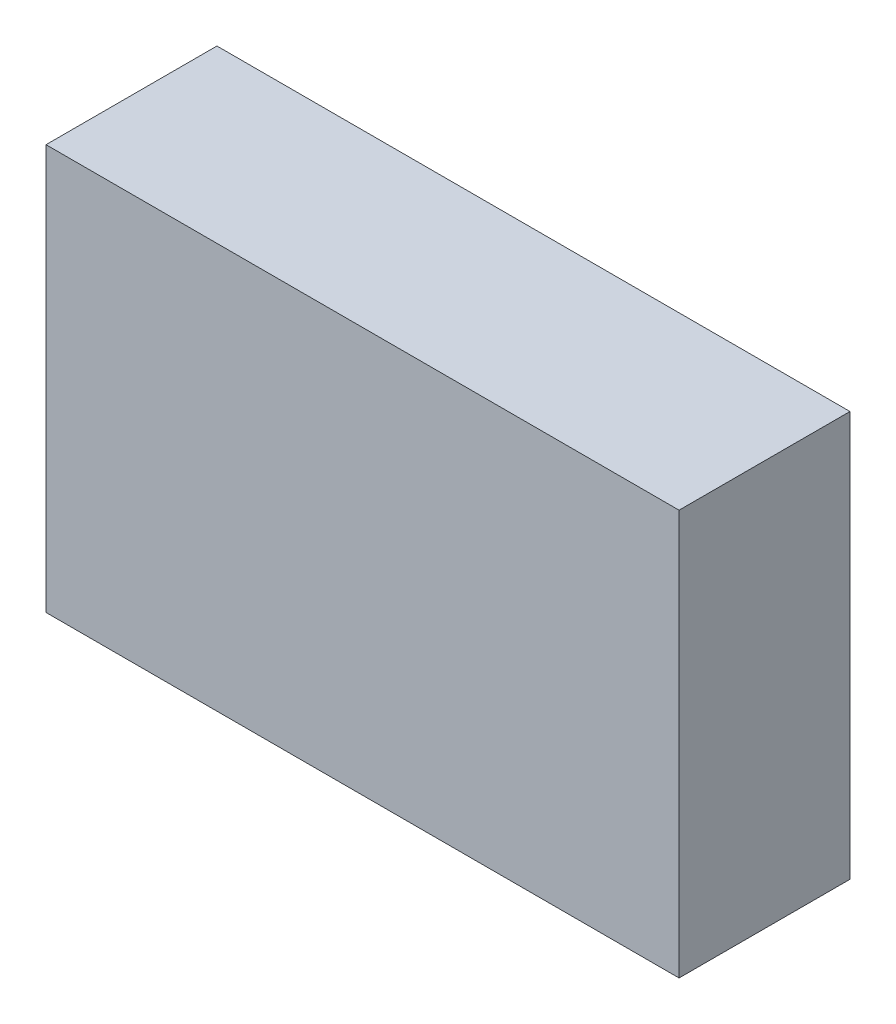
ISO-10303-21;
HEADER;
FILE_DESCRIPTION(('STEP AP214'),'2;1');
FILE_NAME('part.step','',(''),(''),'','','');
FILE_SCHEMA(('AUTOMOTIVE_DESIGN { 1 0 10303 214 1 1 1 1 }'));
ENDSEC;
DATA;
#1=APPLICATION_CONTEXT('core data for automotive mechanical design processes');
#2=APPLICATION_PROTOCOL_DEFINITION('international standard','automotive_design',2000,#1);
#3=PRODUCT_CONTEXT('',#1,'mechanical');
#4=PRODUCT('Part','Part','',(#3));
#5=PRODUCT_RELATED_PRODUCT_CATEGORY('part','',(#4));
#6=PRODUCT_DEFINITION_FORMATION('','',#4);
#7=PRODUCT_DEFINITION_CONTEXT('part definition',#1,'design');
#8=PRODUCT_DEFINITION('design','',#6,#7);
#9=PRODUCT_DEFINITION_SHAPE('','',#8);
#10=(LENGTH_UNIT() NAMED_UNIT(*) SI_UNIT(.MILLI.,.METRE.));
#11=(NAMED_UNIT(*) PLANE_ANGLE_UNIT() SI_UNIT($,.RADIAN.));
#12=(NAMED_UNIT(*) SI_UNIT($,.STERADIAN.) SOLID_ANGLE_UNIT());
#13=UNCERTAINTY_MEASURE_WITH_UNIT(LENGTH_MEASURE(1.E-05),#10,'distance_accuracy_value','');
#14=(GEOMETRIC_REPRESENTATION_CONTEXT(3) GLOBAL_UNCERTAINTY_ASSIGNED_CONTEXT((#13)) GLOBAL_UNIT_ASSIGNED_CONTEXT((#10,
#11,#12)) REPRESENTATION_CONTEXT('',''));
#15=CARTESIAN_POINT('',(0.,0.,0.));
#16=DIRECTION('',(0.,0.,1.));
#17=DIRECTION('',(1.,0.,0.));
#18=AXIS2_PLACEMENT_3D('',#15,#16,#17);
#19=CARTESIAN_POINT('',(0.,0.,1.35));
#20=DIRECTION('',(0.,0.,1.));
#21=DIRECTION('',(1.,0.,0.));
#22=AXIS2_PLACEMENT_3D('',#19,#20,#21);
#23=PLANE('',#22);
#24=DIRECTION('',(1.,0.,0.));
#25=VECTOR('',#24,1.);
#26=CARTESIAN_POINT('',(-2.5,-1.6,1.35));
#27=LINE('',#26,#25);
#28=CARTESIAN_POINT('',(-2.5,-1.6,1.35));
#29=VERTEX_POINT('',#28);
#30=CARTESIAN_POINT('',(2.5,-1.6,1.35));
#31=VERTEX_POINT('',#30);
#32=EDGE_CURVE('E84',#29,#31,#27,.T.);
#33=ORIENTED_EDGE('',*,*,#32,.T.);
#34=DIRECTION('',(0.,1.,0.));
#35=VECTOR('',#34,1.);
#36=CARTESIAN_POINT('',(2.5,-1.6,1.35));
#37=LINE('',#36,#35);
#38=CARTESIAN_POINT('',(2.5,1.6,1.35));
#39=VERTEX_POINT('',#38);
#40=EDGE_CURVE('E70',#31,#39,#37,.T.);
#41=ORIENTED_EDGE('',*,*,#40,.T.);
#42=DIRECTION('',(-1.,0.,0.));
#43=VECTOR('',#42,1.);
#44=CARTESIAN_POINT('',(2.5,1.6,1.35));
#45=LINE('',#44,#43);
#46=CARTESIAN_POINT('',(-2.5,1.6,1.35));
#47=VERTEX_POINT('',#46);
#48=EDGE_CURVE('E101',#39,#47,#45,.T.);
#49=ORIENTED_EDGE('',*,*,#48,.T.);
#50=DIRECTION('',(0.,-1.,0.));
#51=VECTOR('',#50,1.);
#52=CARTESIAN_POINT('',(-2.5,1.6,1.35));
#53=LINE('',#52,#51);
#54=EDGE_CURVE('E11',#47,#29,#53,.T.);
#55=ORIENTED_EDGE('',*,*,#54,.T.);
#56=EDGE_LOOP('',(#33,#41,#49,#55));
#57=FACE_BOUND('',#56,.T.);
#58=ADVANCED_FACE('F17',(#57),#23,.T.);
#59=CARTESIAN_POINT('',(0.,0.,0.));
#60=DIRECTION('',(0.,0.,1.));
#61=DIRECTION('',(1.,0.,0.));
#62=AXIS2_PLACEMENT_3D('',#59,#60,#61);
#63=PLANE('',#62);
#64=DIRECTION('',(0.,-1.,0.));
#65=VECTOR('',#64,1.);
#66=CARTESIAN_POINT('',(-2.5,1.6,0.));
#67=LINE('',#66,#65);
#68=CARTESIAN_POINT('',(-2.5,1.6,0.));
#69=VERTEX_POINT('',#68);
#70=CARTESIAN_POINT('',(-2.5,-1.6,0.));
#71=VERTEX_POINT('',#70);
#72=EDGE_CURVE('E25',#69,#71,#67,.T.);
#73=ORIENTED_EDGE('',*,*,#72,.F.);
#74=DIRECTION('',(-1.,0.,0.));
#75=VECTOR('',#74,1.);
#76=CARTESIAN_POINT('',(2.5,1.6,0.));
#77=LINE('',#76,#75);
#78=CARTESIAN_POINT('',(2.5,1.6,0.));
#79=VERTEX_POINT('',#78);
#80=EDGE_CURVE('E81',#79,#69,#77,.T.);
#81=ORIENTED_EDGE('',*,*,#80,.F.);
#82=DIRECTION('',(0.,1.,0.));
#83=VECTOR('',#82,1.);
#84=CARTESIAN_POINT('',(2.5,-1.6,0.));
#85=LINE('',#84,#83);
#86=CARTESIAN_POINT('',(2.5,-1.6,0.));
#87=VERTEX_POINT('',#86);
#88=EDGE_CURVE('E105',#87,#79,#85,.T.);
#89=ORIENTED_EDGE('',*,*,#88,.F.);
#90=DIRECTION('',(1.,0.,0.));
#91=VECTOR('',#90,1.);
#92=CARTESIAN_POINT('',(-2.5,-1.6,0.));
#93=LINE('',#92,#91);
#94=EDGE_CURVE('E91',#71,#87,#93,.T.);
#95=ORIENTED_EDGE('',*,*,#94,.F.);
#96=EDGE_LOOP('',(#73,#81,#89,#95));
#97=FACE_BOUND('',#96,.T.);
#98=ADVANCED_FACE('F122',(#97),#63,.F.);
#99=CARTESIAN_POINT('',(-2.5,1.6,0.));
#100=DIRECTION('',(1.,0.,0.));
#101=DIRECTION('',(0.,1.,0.));
#102=AXIS2_PLACEMENT_3D('',#99,#100,#101);
#103=PLANE('',#102);
#104=ORIENTED_EDGE('',*,*,#72,.T.);
#105=DIRECTION('',(0.,0.,1.));
#106=VECTOR('',#105,1.);
#107=CARTESIAN_POINT('',(-2.5,-1.6,0.));
#108=LINE('',#107,#106);
#109=EDGE_CURVE('E88',#71,#29,#108,.T.);
#110=ORIENTED_EDGE('',*,*,#109,.T.);
#111=ORIENTED_EDGE('',*,*,#54,.F.);
#112=DIRECTION('',(0.,0.,1.));
#113=VECTOR('',#112,1.);
#114=CARTESIAN_POINT('',(-2.5,1.6,0.));
#115=LINE('',#114,#113);
#116=EDGE_CURVE('E113',#69,#47,#115,.T.);
#117=ORIENTED_EDGE('',*,*,#116,.F.);
#118=EDGE_LOOP('',(#104,#110,#111,#117));
#119=FACE_BOUND('',#118,.T.);
#120=ADVANCED_FACE('F121',(#119),#103,.F.);
#121=CARTESIAN_POINT('',(2.5,1.6,0.));
#122=DIRECTION('',(0.,-1.,0.));
#123=DIRECTION('',(0.,0.,-1.));
#124=AXIS2_PLACEMENT_3D('',#121,#122,#123);
#125=PLANE('',#124);
#126=ORIENTED_EDGE('',*,*,#80,.T.);
#127=ORIENTED_EDGE('',*,*,#116,.T.);
#128=ORIENTED_EDGE('',*,*,#48,.F.);
#129=DIRECTION('',(0.,0.,1.));
#130=VECTOR('',#129,1.);
#131=CARTESIAN_POINT('',(2.5,1.6,0.));
#132=LINE('',#131,#130);
#133=EDGE_CURVE('E78',#79,#39,#132,.T.);
#134=ORIENTED_EDGE('',*,*,#133,.F.);
#135=EDGE_LOOP('',(#126,#127,#128,#134));
#136=FACE_BOUND('',#135,.T.);
#137=ADVANCED_FACE('F120',(#136),#125,.F.);
#138=CARTESIAN_POINT('',(2.5,-1.6,0.));
#139=DIRECTION('',(-1.,0.,0.));
#140=DIRECTION('',(0.,0.,1.));
#141=AXIS2_PLACEMENT_3D('',#138,#139,#140);
#142=PLANE('',#141);
#143=ORIENTED_EDGE('',*,*,#88,.T.);
#144=ORIENTED_EDGE('',*,*,#133,.T.);
#145=ORIENTED_EDGE('',*,*,#40,.F.);
#146=DIRECTION('',(0.,0.,1.));
#147=VECTOR('',#146,1.);
#148=CARTESIAN_POINT('',(2.5,-1.6,0.));
#149=LINE('',#148,#147);
#150=EDGE_CURVE('E75',#87,#31,#149,.T.);
#151=ORIENTED_EDGE('',*,*,#150,.F.);
#152=EDGE_LOOP('',(#143,#144,#145,#151));
#153=FACE_BOUND('',#152,.T.);
#154=ADVANCED_FACE('F73',(#153),#142,.F.);
#155=CARTESIAN_POINT('',(-2.5,-1.6,0.));
#156=DIRECTION('',(0.,1.,0.));
#157=DIRECTION('',(1.,0.,0.));
#158=AXIS2_PLACEMENT_3D('',#155,#156,#157);
#159=PLANE('',#158);
#160=ORIENTED_EDGE('',*,*,#94,.T.);
#161=ORIENTED_EDGE('',*,*,#150,.T.);
#162=ORIENTED_EDGE('',*,*,#32,.F.);
#163=ORIENTED_EDGE('',*,*,#109,.F.);
#164=EDGE_LOOP('',(#160,#161,#162,#163));
#165=FACE_BOUND('',#164,.T.);
#166=ADVANCED_FACE('F90',(#165),#159,.F.);
#167=CLOSED_SHELL('',(#58,#98,#120,#137,#154,#166));
#168=MANIFOLD_SOLID_BREP('B1',#167);
#169=ADVANCED_BREP_SHAPE_REPRESENTATION('',(#18,#168),#14);
#170=SHAPE_DEFINITION_REPRESENTATION(#9,#169);
ENDSEC;
END-ISO-10303-21;
